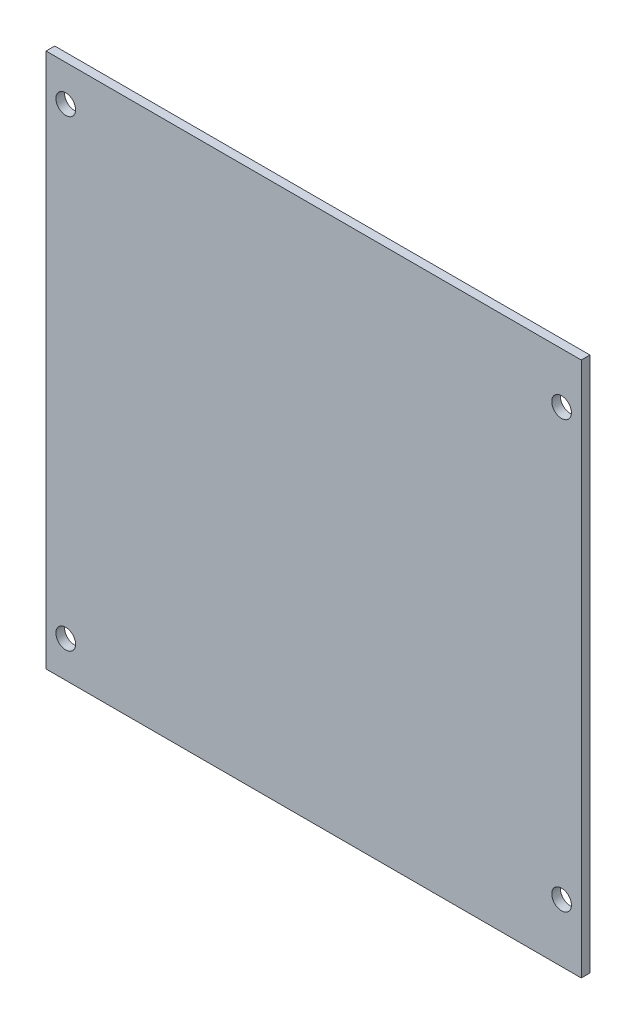
ISO-10303-21;
HEADER;
FILE_DESCRIPTION(('STEP AP214'),'2;1');
FILE_NAME('part.step','',(''),(''),'','','');
FILE_SCHEMA(('AUTOMOTIVE_DESIGN { 1 0 10303 214 1 1 1 1 }'));
ENDSEC;
DATA;
#1=APPLICATION_CONTEXT('core data for automotive mechanical design processes');
#2=APPLICATION_PROTOCOL_DEFINITION('international standard','automotive_design',2000,#1);
#3=PRODUCT_CONTEXT('',#1,'mechanical');
#4=PRODUCT('Part','Part','',(#3));
#5=PRODUCT_RELATED_PRODUCT_CATEGORY('part','',(#4));
#6=PRODUCT_DEFINITION_FORMATION('','',#4);
#7=PRODUCT_DEFINITION_CONTEXT('part definition',#1,'design');
#8=PRODUCT_DEFINITION('design','',#6,#7);
#9=PRODUCT_DEFINITION_SHAPE('','',#8);
#10=(LENGTH_UNIT() NAMED_UNIT(*) SI_UNIT(.MILLI.,.METRE.));
#11=(NAMED_UNIT(*) PLANE_ANGLE_UNIT() SI_UNIT($,.RADIAN.));
#12=(NAMED_UNIT(*) SI_UNIT($,.STERADIAN.) SOLID_ANGLE_UNIT());
#13=UNCERTAINTY_MEASURE_WITH_UNIT(LENGTH_MEASURE(1.E-05),#10,'distance_accuracy_value','');
#14=(GEOMETRIC_REPRESENTATION_CONTEXT(3) GLOBAL_UNCERTAINTY_ASSIGNED_CONTEXT((#13)) GLOBAL_UNIT_ASSIGNED_CONTEXT((#10,
#11,#12)) REPRESENTATION_CONTEXT('',''));
#15=CARTESIAN_POINT('',(0.,0.,0.));
#16=DIRECTION('',(0.,0.,1.));
#17=DIRECTION('',(1.,0.,0.));
#18=AXIS2_PLACEMENT_3D('',#15,#16,#17);
#19=CARTESIAN_POINT('',(-46.25,-46.25,1.5));
#20=DIRECTION('',(1.,0.,0.));
#21=DIRECTION('',(0.,0.,-1.));
#22=AXIS2_PLACEMENT_3D('',#19,#20,#21);
#23=PLANE('',#22);
#24=DIRECTION('',(0.,-1.,0.));
#25=VECTOR('',#24,1.);
#26=CARTESIAN_POINT('',(-46.25,-46.25,0.));
#27=LINE('',#26,#25);
#28=CARTESIAN_POINT('',(-46.25,46.25,0.));
#29=VERTEX_POINT('',#28);
#30=CARTESIAN_POINT('',(-46.25,-46.25,0.));
#31=VERTEX_POINT('',#30);
#32=EDGE_CURVE('E100',#29,#31,#27,.T.);
#33=ORIENTED_EDGE('',*,*,#32,.T.);
#34=DIRECTION('',(0.,0.,-1.));
#35=VECTOR('',#34,1.);
#36=CARTESIAN_POINT('',(-46.25,-46.25,1.5));
#37=LINE('',#36,#35);
#38=CARTESIAN_POINT('',(-46.25,-46.25,1.5));
#39=VERTEX_POINT('',#38);
#40=EDGE_CURVE('E11',#39,#31,#37,.T.);
#41=ORIENTED_EDGE('',*,*,#40,.F.);
#42=DIRECTION('',(0.,-1.,0.));
#43=VECTOR('',#42,1.);
#44=CARTESIAN_POINT('',(-46.25,-46.25,1.5));
#45=LINE('',#44,#43);
#46=CARTESIAN_POINT('',(-46.25,46.25,1.5));
#47=VERTEX_POINT('',#46);
#48=EDGE_CURVE('E88',#47,#39,#45,.T.);
#49=ORIENTED_EDGE('',*,*,#48,.F.);
#50=DIRECTION('',(0.,0.,-1.));
#51=VECTOR('',#50,1.);
#52=CARTESIAN_POINT('',(-46.25,46.25,1.5));
#53=LINE('',#52,#51);
#54=EDGE_CURVE('E96',#47,#29,#53,.T.);
#55=ORIENTED_EDGE('',*,*,#54,.T.);
#56=EDGE_LOOP('',(#33,#41,#49,#55));
#57=FACE_BOUND('',#56,.T.);
#58=ADVANCED_FACE('F37',(#57),#23,.F.);
#59=CARTESIAN_POINT('',(46.25,-46.25,1.5));
#60=DIRECTION('',(0.,1.,0.));
#61=DIRECTION('',(-1.,0.,0.));
#62=AXIS2_PLACEMENT_3D('',#59,#60,#61);
#63=PLANE('',#62);
#64=DIRECTION('',(1.,0.,0.));
#65=VECTOR('',#64,1.);
#66=CARTESIAN_POINT('',(46.25,-46.25,0.));
#67=LINE('',#66,#65);
#68=CARTESIAN_POINT('',(46.25,-46.25,0.));
#69=VERTEX_POINT('',#68);
#70=EDGE_CURVE('E92',#31,#69,#67,.T.);
#71=ORIENTED_EDGE('',*,*,#70,.T.);
#72=DIRECTION('',(0.,0.,-1.));
#73=VECTOR('',#72,1.);
#74=CARTESIAN_POINT('',(46.25,-46.25,1.5));
#75=LINE('',#74,#73);
#76=CARTESIAN_POINT('',(46.25,-46.25,1.5));
#77=VERTEX_POINT('',#76);
#78=EDGE_CURVE('E45',#77,#69,#75,.T.);
#79=ORIENTED_EDGE('',*,*,#78,.F.);
#80=DIRECTION('',(1.,0.,0.));
#81=VECTOR('',#80,1.);
#82=CARTESIAN_POINT('',(46.25,-46.25,1.5));
#83=LINE('',#82,#81);
#84=EDGE_CURVE('E83',#39,#77,#83,.T.);
#85=ORIENTED_EDGE('',*,*,#84,.F.);
#86=ORIENTED_EDGE('',*,*,#40,.T.);
#87=EDGE_LOOP('',(#71,#79,#85,#86));
#88=FACE_BOUND('',#87,.T.);
#89=ADVANCED_FACE('F91',(#88),#63,.F.);
#90=CARTESIAN_POINT('',(46.25,-46.25,1.5));
#91=DIRECTION('',(-1.,0.,0.));
#92=DIRECTION('',(0.,0.,1.));
#93=AXIS2_PLACEMENT_3D('',#90,#91,#92);
#94=PLANE('',#93);
#95=DIRECTION('',(0.,1.,0.));
#96=VECTOR('',#95,1.);
#97=CARTESIAN_POINT('',(46.25,-46.25,0.));
#98=LINE('',#97,#96);
#99=CARTESIAN_POINT('',(46.25,46.25,0.));
#100=VERTEX_POINT('',#99);
#101=EDGE_CURVE('E70',#69,#100,#98,.T.);
#102=ORIENTED_EDGE('',*,*,#101,.T.);
#103=DIRECTION('',(0.,0.,-1.));
#104=VECTOR('',#103,1.);
#105=CARTESIAN_POINT('',(46.25,46.25,1.5));
#106=LINE('',#105,#104);
#107=CARTESIAN_POINT('',(46.25,46.25,1.5));
#108=VERTEX_POINT('',#107);
#109=EDGE_CURVE('E93',#108,#100,#106,.T.);
#110=ORIENTED_EDGE('',*,*,#109,.F.);
#111=DIRECTION('',(0.,1.,0.));
#112=VECTOR('',#111,1.);
#113=CARTESIAN_POINT('',(46.25,-46.25,1.5));
#114=LINE('',#113,#112);
#115=EDGE_CURVE('E86',#77,#108,#114,.T.);
#116=ORIENTED_EDGE('',*,*,#115,.F.);
#117=ORIENTED_EDGE('',*,*,#78,.T.);
#118=EDGE_LOOP('',(#102,#110,#116,#117));
#119=FACE_BOUND('',#118,.T.);
#120=ADVANCED_FACE('F94',(#119),#94,.F.);
#121=CARTESIAN_POINT('',(46.25,46.25,1.5));
#122=DIRECTION('',(0.,-1.,0.));
#123=DIRECTION('',(1.,0.,0.));
#124=AXIS2_PLACEMENT_3D('',#121,#122,#123);
#125=PLANE('',#124);
#126=DIRECTION('',(-1.,0.,0.));
#127=VECTOR('',#126,1.);
#128=CARTESIAN_POINT('',(46.25,46.25,0.));
#129=LINE('',#128,#127);
#130=EDGE_CURVE('E76',#100,#29,#129,.T.);
#131=ORIENTED_EDGE('',*,*,#130,.T.);
#132=ORIENTED_EDGE('',*,*,#54,.F.);
#133=DIRECTION('',(-1.,0.,0.));
#134=VECTOR('',#133,1.);
#135=CARTESIAN_POINT('',(46.25,46.25,1.5));
#136=LINE('',#135,#134);
#137=EDGE_CURVE('E53',#108,#47,#136,.T.);
#138=ORIENTED_EDGE('',*,*,#137,.F.);
#139=ORIENTED_EDGE('',*,*,#109,.T.);
#140=EDGE_LOOP('',(#131,#132,#138,#139));
#141=FACE_BOUND('',#140,.T.);
#142=ADVANCED_FACE('F108',(#141),#125,.F.);
#143=CARTESIAN_POINT('',(0.,0.,1.5));
#144=DIRECTION('',(0.,0.,1.));
#145=DIRECTION('',(1.,0.,0.));
#146=AXIS2_PLACEMENT_3D('',#143,#144,#145);
#147=PLANE('',#146);
#148=CARTESIAN_POINT('',(42.85,-36.2000000000001,1.5));
#149=DIRECTION('',(0.,0.,1.));
#150=DIRECTION('',(1.,0.,0.));
#151=AXIS2_PLACEMENT_3D('',#148,#149,#150);
#152=CIRCLE('',#151,1.7);
#153=CARTESIAN_POINT('',(44.55,-36.2000000000001,1.5));
#154=VERTEX_POINT('',#153);
#155=EDGE_CURVE('E134',#154,#154,#152,.T.);
#156=ORIENTED_EDGE('',*,*,#155,.F.);
#157=EDGE_LOOP('',(#156));
#158=FACE_BOUND('',#157,.T.);
#159=CARTESIAN_POINT('',(42.85,37.5,1.5));
#160=DIRECTION('',(0.,0.,1.));
#161=DIRECTION('',(1.,0.,0.));
#162=AXIS2_PLACEMENT_3D('',#159,#160,#161);
#163=CIRCLE('',#162,1.7);
#164=CARTESIAN_POINT('',(44.55,37.5,1.5));
#165=VERTEX_POINT('',#164);
#166=EDGE_CURVE('E128',#165,#165,#163,.T.);
#167=ORIENTED_EDGE('',*,*,#166,.F.);
#168=EDGE_LOOP('',(#167));
#169=FACE_BOUND('',#168,.T.);
#170=CARTESIAN_POINT('',(-42.85,40.,1.5));
#171=DIRECTION('',(0.,0.,1.));
#172=DIRECTION('',(1.,0.,0.));
#173=AXIS2_PLACEMENT_3D('',#170,#171,#172);
#174=CIRCLE('',#173,1.7);
#175=CARTESIAN_POINT('',(-41.15,40.,1.5));
#176=VERTEX_POINT('',#175);
#177=EDGE_CURVE('E122',#176,#176,#174,.T.);
#178=ORIENTED_EDGE('',*,*,#177,.F.);
#179=EDGE_LOOP('',(#178));
#180=FACE_BOUND('',#179,.T.);
#181=CARTESIAN_POINT('',(-42.8500000000001,-40.,1.5));
#182=DIRECTION('',(0.,0.,1.));
#183=DIRECTION('',(1.,0.,0.));
#184=AXIS2_PLACEMENT_3D('',#181,#182,#183);
#185=CIRCLE('',#184,1.7);
#186=CARTESIAN_POINT('',(-41.15,-40.,1.5));
#187=VERTEX_POINT('',#186);
#188=EDGE_CURVE('E116',#187,#187,#185,.T.);
#189=ORIENTED_EDGE('',*,*,#188,.F.);
#190=EDGE_LOOP('',(#189));
#191=FACE_BOUND('',#190,.T.);
#192=ORIENTED_EDGE('',*,*,#48,.T.);
#193=ORIENTED_EDGE('',*,*,#84,.T.);
#194=ORIENTED_EDGE('',*,*,#115,.T.);
#195=ORIENTED_EDGE('',*,*,#137,.T.);
#196=EDGE_LOOP('',(#192,#193,#194,#195));
#197=FACE_BOUND('',#196,.T.);
#198=ADVANCED_FACE('F84',(#158,#169,#180,#191,#197),#147,.T.);
#199=CARTESIAN_POINT('',(0.,0.,0.));
#200=DIRECTION('',(0.,0.,1.));
#201=DIRECTION('',(1.,0.,0.));
#202=AXIS2_PLACEMENT_3D('',#199,#200,#201);
#203=PLANE('',#202);
#204=CARTESIAN_POINT('',(42.85,-36.2000000000001,0.));
#205=DIRECTION('',(0.,0.,1.));
#206=DIRECTION('',(1.,0.,0.));
#207=AXIS2_PLACEMENT_3D('',#204,#205,#206);
#208=CIRCLE('',#207,1.7);
#209=CARTESIAN_POINT('',(44.55,-36.2000000000001,0.));
#210=VERTEX_POINT('',#209);
#211=EDGE_CURVE('E131',#210,#210,#208,.T.);
#212=ORIENTED_EDGE('',*,*,#211,.T.);
#213=EDGE_LOOP('',(#212));
#214=FACE_BOUND('',#213,.T.);
#215=CARTESIAN_POINT('',(42.85,37.5,0.));
#216=DIRECTION('',(0.,0.,1.));
#217=DIRECTION('',(1.,0.,0.));
#218=AXIS2_PLACEMENT_3D('',#215,#216,#217);
#219=CIRCLE('',#218,1.7);
#220=CARTESIAN_POINT('',(44.55,37.5,0.));
#221=VERTEX_POINT('',#220);
#222=EDGE_CURVE('E125',#221,#221,#219,.T.);
#223=ORIENTED_EDGE('',*,*,#222,.T.);
#224=EDGE_LOOP('',(#223));
#225=FACE_BOUND('',#224,.T.);
#226=CARTESIAN_POINT('',(-42.85,40.,0.));
#227=DIRECTION('',(0.,0.,1.));
#228=DIRECTION('',(1.,0.,0.));
#229=AXIS2_PLACEMENT_3D('',#226,#227,#228);
#230=CIRCLE('',#229,1.7);
#231=CARTESIAN_POINT('',(-41.15,40.,0.));
#232=VERTEX_POINT('',#231);
#233=EDGE_CURVE('E119',#232,#232,#230,.T.);
#234=ORIENTED_EDGE('',*,*,#233,.T.);
#235=EDGE_LOOP('',(#234));
#236=FACE_BOUND('',#235,.T.);
#237=CARTESIAN_POINT('',(-42.8500000000001,-40.,0.));
#238=DIRECTION('',(0.,0.,1.));
#239=DIRECTION('',(1.,0.,0.));
#240=AXIS2_PLACEMENT_3D('',#237,#238,#239);
#241=CIRCLE('',#240,1.7);
#242=CARTESIAN_POINT('',(-41.15,-40.,0.));
#243=VERTEX_POINT('',#242);
#244=EDGE_CURVE('E103',#243,#243,#241,.T.);
#245=ORIENTED_EDGE('',*,*,#244,.T.);
#246=EDGE_LOOP('',(#245));
#247=FACE_BOUND('',#246,.T.);
#248=ORIENTED_EDGE('',*,*,#32,.F.);
#249=ORIENTED_EDGE('',*,*,#130,.F.);
#250=ORIENTED_EDGE('',*,*,#101,.F.);
#251=ORIENTED_EDGE('',*,*,#70,.F.);
#252=EDGE_LOOP('',(#248,#249,#250,#251));
#253=FACE_BOUND('',#252,.T.);
#254=ADVANCED_FACE('F111',(#214,#225,#236,#247,#253),#203,.F.);
#255=CARTESIAN_POINT('',(-42.8500000000001,-40.,1.5));
#256=DIRECTION('',(0.,0.,1.));
#257=DIRECTION('',(1.,0.,0.));
#258=AXIS2_PLACEMENT_3D('',#255,#256,#257);
#259=CYLINDRICAL_SURFACE('',#258,1.7);
#260=ORIENTED_EDGE('',*,*,#244,.F.);
#261=EDGE_LOOP('',(#260));
#262=FACE_BOUND('',#261,.T.);
#263=ORIENTED_EDGE('',*,*,#188,.T.);
#264=EDGE_LOOP('',(#263));
#265=FACE_BOUND('',#264,.T.);
#266=ADVANCED_FACE('F149',(#262,#265),#259,.F.);
#267=CARTESIAN_POINT('',(-42.85,40.,1.5));
#268=DIRECTION('',(0.,0.,1.));
#269=DIRECTION('',(1.,0.,0.));
#270=AXIS2_PLACEMENT_3D('',#267,#268,#269);
#271=CYLINDRICAL_SURFACE('',#270,1.7);
#272=ORIENTED_EDGE('',*,*,#233,.F.);
#273=EDGE_LOOP('',(#272));
#274=FACE_BOUND('',#273,.T.);
#275=ORIENTED_EDGE('',*,*,#177,.T.);
#276=EDGE_LOOP('',(#275));
#277=FACE_BOUND('',#276,.T.);
#278=ADVANCED_FACE('F151',(#274,#277),#271,.F.);
#279=CARTESIAN_POINT('',(42.85,37.5,1.5));
#280=DIRECTION('',(0.,0.,1.));
#281=DIRECTION('',(1.,0.,0.));
#282=AXIS2_PLACEMENT_3D('',#279,#280,#281);
#283=CYLINDRICAL_SURFACE('',#282,1.7);
#284=ORIENTED_EDGE('',*,*,#222,.F.);
#285=EDGE_LOOP('',(#284));
#286=FACE_BOUND('',#285,.T.);
#287=ORIENTED_EDGE('',*,*,#166,.T.);
#288=EDGE_LOOP('',(#287));
#289=FACE_BOUND('',#288,.T.);
#290=ADVANCED_FACE('F158',(#286,#289),#283,.F.);
#291=CARTESIAN_POINT('',(42.85,-36.2000000000001,1.5));
#292=DIRECTION('',(0.,0.,1.));
#293=DIRECTION('',(1.,0.,0.));
#294=AXIS2_PLACEMENT_3D('',#291,#292,#293);
#295=CYLINDRICAL_SURFACE('',#294,1.7);
#296=ORIENTED_EDGE('',*,*,#211,.F.);
#297=EDGE_LOOP('',(#296));
#298=FACE_BOUND('',#297,.T.);
#299=ORIENTED_EDGE('',*,*,#155,.T.);
#300=EDGE_LOOP('',(#299));
#301=FACE_BOUND('',#300,.T.);
#302=ADVANCED_FACE('F138',(#298,#301),#295,.F.);
#303=CLOSED_SHELL('',(#58,#89,#120,#142,#198,#254,#266,#278,#290,#302));
#304=MANIFOLD_SOLID_BREP('B2',#303);
#305=ADVANCED_BREP_SHAPE_REPRESENTATION('',(#18,#304),#14);
#306=SHAPE_DEFINITION_REPRESENTATION(#9,#305);
ENDSEC;
END-ISO-10303-21;
